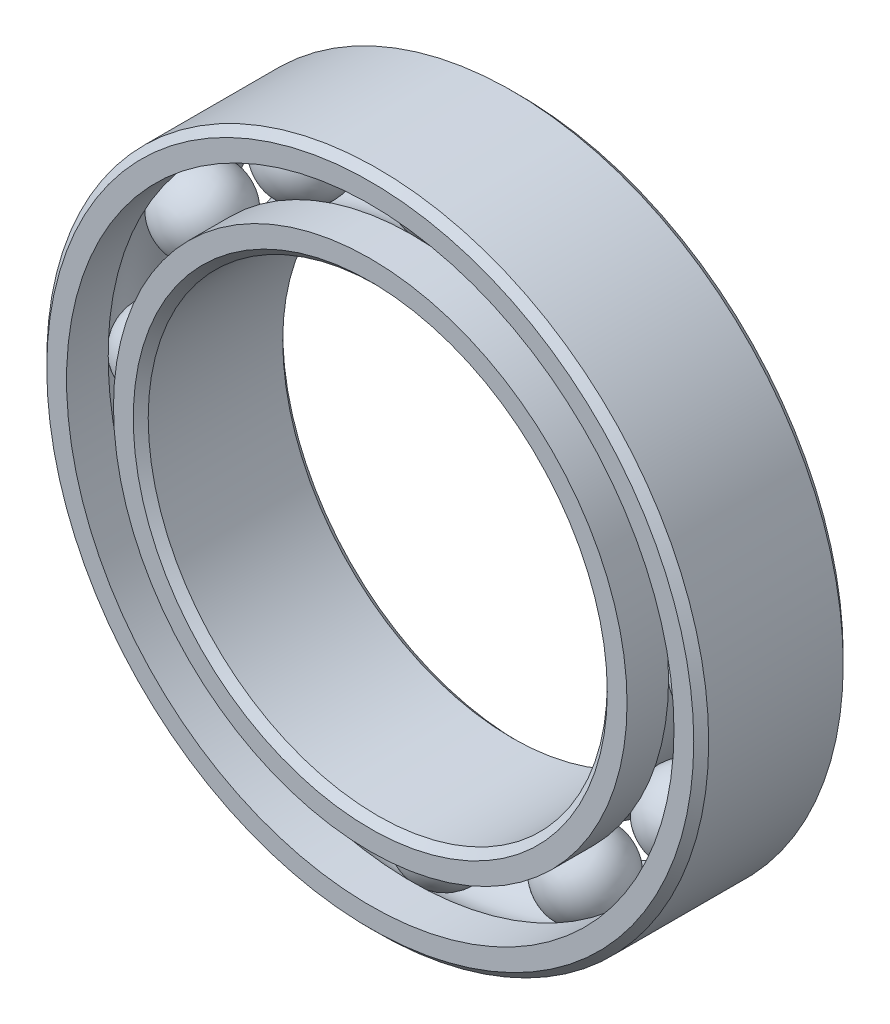
ISO-10303-21;
HEADER;
FILE_DESCRIPTION(('STEP AP214'),'2;1');
FILE_NAME('part.step','',(''),(''),'','','');
FILE_SCHEMA(('AUTOMOTIVE_DESIGN { 1 0 10303 214 1 1 1 1 }'));
ENDSEC;
DATA;
#1=APPLICATION_CONTEXT('core data for automotive mechanical design processes');
#2=APPLICATION_PROTOCOL_DEFINITION('international standard','automotive_design',2000,#1);
#3=PRODUCT_CONTEXT('',#1,'mechanical');
#4=PRODUCT('Part','Part','',(#3));
#5=PRODUCT_RELATED_PRODUCT_CATEGORY('part','',(#4));
#6=PRODUCT_DEFINITION_FORMATION('','',#4);
#7=PRODUCT_DEFINITION_CONTEXT('part definition',#1,'design');
#8=PRODUCT_DEFINITION('design','',#6,#7);
#9=PRODUCT_DEFINITION_SHAPE('','',#8);
#10=(LENGTH_UNIT() NAMED_UNIT(*) SI_UNIT(.MILLI.,.METRE.));
#11=(NAMED_UNIT(*) PLANE_ANGLE_UNIT() SI_UNIT($,.RADIAN.));
#12=(NAMED_UNIT(*) SI_UNIT($,.STERADIAN.) SOLID_ANGLE_UNIT());
#13=UNCERTAINTY_MEASURE_WITH_UNIT(LENGTH_MEASURE(1.E-05),#10,'distance_accuracy_value','');
#14=(GEOMETRIC_REPRESENTATION_CONTEXT(3) GLOBAL_UNCERTAINTY_ASSIGNED_CONTEXT((#13)) GLOBAL_UNIT_ASSIGNED_CONTEXT((#10,
#11,#12)) REPRESENTATION_CONTEXT('',''));
#15=CARTESIAN_POINT('',(0.,0.,0.));
#16=DIRECTION('',(0.,0.,1.));
#17=DIRECTION('',(1.,0.,0.));
#18=AXIS2_PLACEMENT_3D('',#15,#16,#17);
#19=CARTESIAN_POINT('',(-6.56249999999985,11.3665834246708,0.));
#20=DIRECTION('',(0.,0.,1.));
#21=DIRECTION('',(-0.499999999999989,0.866025403784445,0.));
#22=AXIS2_PLACEMENT_3D('',#19,#20,#21);
#23=SPHERICAL_SURFACE('',#22,1.90455682813241);
#24=CARTESIAN_POINT('',(-6.56249999999985,11.3665834246708,1.90455682813241));
#25=VERTEX_POINT('',#24);
#26=VERTEX_LOOP('',#25);
#27=FACE_BOUND('',#26,.T.);
#28=ADVANCED_FACE('F38',(#27),#23,.T.);
#29=CLOSED_SHELL('',(#28));
#30=MANIFOLD_SOLID_BREP('B2',#29);
#31=CARTESIAN_POINT('',(-11.3665834246707,6.56250000000013,0.));
#32=DIRECTION('',(0.,0.,1.));
#33=DIRECTION('',(-0.866025403784433,0.50000000000001,0.));
#34=AXIS2_PLACEMENT_3D('',#31,#32,#33);
#35=SPHERICAL_SURFACE('',#34,1.90455682813241);
#36=CARTESIAN_POINT('',(-11.3665834246707,6.56250000000013,1.90455682813241));
#37=VERTEX_POINT('',#36);
#38=VERTEX_LOOP('',#37);
#39=FACE_BOUND('',#38,.T.);
#40=ADVANCED_FACE('F59',(#39),#35,.T.);
#41=CLOSED_SHELL('',(#40));
#42=MANIFOLD_SOLID_BREP('B6',#41);
#43=CARTESIAN_POINT('',(-13.125,1.37477077716948E-13,0.));
#44=DIRECTION('',(0.,0.,1.));
#45=DIRECTION('',(-1.,0.,0.));
#46=AXIS2_PLACEMENT_3D('',#43,#44,#45);
#47=SPHERICAL_SURFACE('',#46,1.90455682813241);
#48=CARTESIAN_POINT('',(-13.125,1.37477077716948E-13,1.90455682813241));
#49=VERTEX_POINT('',#48);
#50=VERTEX_LOOP('',#49);
#51=FACE_BOUND('',#50,.T.);
#52=ADVANCED_FACE('F80',(#51),#47,.T.);
#53=CLOSED_SHELL('',(#52));
#54=MANIFOLD_SOLID_BREP('B34',#53);
#55=CARTESIAN_POINT('',(-11.3665834246708,-6.56249999999989,0.));
#56=DIRECTION('',(0.,0.,1.));
#57=DIRECTION('',(-0.866025403784443,-0.499999999999992,0.));
#58=AXIS2_PLACEMENT_3D('',#55,#56,#57);
#59=SPHERICAL_SURFACE('',#58,1.90455682813241);
#60=CARTESIAN_POINT('',(-11.3665834246708,-6.56249999999989,1.90455682813241));
#61=VERTEX_POINT('',#60);
#62=VERTEX_LOOP('',#61);
#63=FACE_BOUND('',#62,.T.);
#64=ADVANCED_FACE('F101',(#63),#59,.T.);
#65=CLOSED_SHELL('',(#64));
#66=MANIFOLD_SOLID_BREP('B55',#65);
#67=CARTESIAN_POINT('',(-6.56250000000009,-11.3665834246707,0.));
#68=DIRECTION('',(0.,0.,1.));
#69=DIRECTION('',(-0.500000000000007,-0.866025403784435,0.));
#70=AXIS2_PLACEMENT_3D('',#67,#68,#69);
#71=SPHERICAL_SURFACE('',#70,1.90455682813241);
#72=CARTESIAN_POINT('',(-6.56250000000009,-11.3665834246707,1.90455682813241));
#73=VERTEX_POINT('',#72);
#74=VERTEX_LOOP('',#73);
#75=FACE_BOUND('',#74,.T.);
#76=ADVANCED_FACE('F122',(#75),#71,.T.);
#77=CLOSED_SHELL('',(#76));
#78=MANIFOLD_SOLID_BREP('B76',#77);
#79=CARTESIAN_POINT('',(0.,-13.125,0.));
#80=DIRECTION('',(0.,0.,1.));
#81=DIRECTION('',(0.,-1.,0.));
#82=AXIS2_PLACEMENT_3D('',#79,#80,#81);
#83=SPHERICAL_SURFACE('',#82,1.90455682813241);
#84=CARTESIAN_POINT('',(0.,-13.125,1.90455682813241));
#85=VERTEX_POINT('',#84);
#86=VERTEX_LOOP('',#85);
#87=FACE_BOUND('',#86,.T.);
#88=ADVANCED_FACE('F143',(#87),#83,.T.);
#89=CLOSED_SHELL('',(#88));
#90=MANIFOLD_SOLID_BREP('B97',#89);
#91=CARTESIAN_POINT('',(6.56249999999993,-11.3665834246708,0.));
#92=DIRECTION('',(0.,0.,1.));
#93=DIRECTION('',(0.499999999999995,-0.866025403784442,0.));
#94=AXIS2_PLACEMENT_3D('',#91,#92,#93);
#95=SPHERICAL_SURFACE('',#94,1.90455682813241);
#96=CARTESIAN_POINT('',(6.56249999999993,-11.3665834246708,1.90455682813241));
#97=VERTEX_POINT('',#96);
#98=VERTEX_LOOP('',#97);
#99=FACE_BOUND('',#98,.T.);
#100=ADVANCED_FACE('F164',(#99),#95,.T.);
#101=CLOSED_SHELL('',(#100));
#102=MANIFOLD_SOLID_BREP('B118',#101);
#103=CARTESIAN_POINT('',(11.3665834246707,-6.56250000000005,0.));
#104=DIRECTION('',(0.,0.,1.));
#105=DIRECTION('',(0.866025403784436,-0.500000000000004,0.));
#106=AXIS2_PLACEMENT_3D('',#103,#104,#105);
#107=SPHERICAL_SURFACE('',#106,1.90455682813241);
#108=CARTESIAN_POINT('',(11.3665834246707,-6.56250000000005,1.90455682813241));
#109=VERTEX_POINT('',#108);
#110=VERTEX_LOOP('',#109);
#111=FACE_BOUND('',#110,.T.);
#112=ADVANCED_FACE('F185',(#111),#107,.T.);
#113=CLOSED_SHELL('',(#112));
#114=MANIFOLD_SOLID_BREP('B139',#113);
#115=CARTESIAN_POINT('',(13.125,0.,0.));
#116=DIRECTION('',(0.,0.,1.));
#117=DIRECTION('',(1.,0.,0.));
#118=AXIS2_PLACEMENT_3D('',#115,#116,#117);
#119=SPHERICAL_SURFACE('',#118,1.90455682813241);
#120=CARTESIAN_POINT('',(13.125,0.,1.90455682813241));
#121=VERTEX_POINT('',#120);
#122=VERTEX_LOOP('',#121);
#123=FACE_BOUND('',#122,.T.);
#124=ADVANCED_FACE('F206',(#123),#119,.T.);
#125=CLOSED_SHELL('',(#124));
#126=MANIFOLD_SOLID_BREP('B160',#125);
#127=CARTESIAN_POINT('',(11.3665834246708,6.56249999999997,0.));
#128=DIRECTION('',(0.,0.,1.));
#129=DIRECTION('',(0.86602540378444,0.499999999999998,0.));
#130=AXIS2_PLACEMENT_3D('',#127,#128,#129);
#131=SPHERICAL_SURFACE('',#130,1.90455682813241);
#132=CARTESIAN_POINT('',(11.3665834246708,6.56249999999997,1.90455682813241));
#133=VERTEX_POINT('',#132);
#134=VERTEX_LOOP('',#133);
#135=FACE_BOUND('',#134,.T.);
#136=ADVANCED_FACE('F227',(#135),#131,.T.);
#137=CLOSED_SHELL('',(#136));
#138=MANIFOLD_SOLID_BREP('B181',#137);
#139=CARTESIAN_POINT('',(6.56250000000001,11.3665834246707,0.));
#140=DIRECTION('',(0.,0.,1.));
#141=DIRECTION('',(0.500000000000001,0.866025403784438,0.));
#142=AXIS2_PLACEMENT_3D('',#139,#140,#141);
#143=SPHERICAL_SURFACE('',#142,1.90455682813241);
#144=CARTESIAN_POINT('',(6.56250000000001,11.3665834246707,1.90455682813241));
#145=VERTEX_POINT('',#144);
#146=VERTEX_LOOP('',#145);
#147=FACE_BOUND('',#146,.T.);
#148=ADVANCED_FACE('F248',(#147),#143,.T.);
#149=CLOSED_SHELL('',(#148));
#150=MANIFOLD_SOLID_BREP('B202',#149);
#151=CARTESIAN_POINT('',(0.,13.125,0.));
#152=DIRECTION('',(0.,0.,1.));
#153=DIRECTION('',(0.,1.,0.));
#154=AXIS2_PLACEMENT_3D('',#151,#152,#153);
#155=SPHERICAL_SURFACE('',#154,1.90455682813241);
#156=CARTESIAN_POINT('',(0.,13.125,1.90455682813241));
#157=VERTEX_POINT('',#156);
#158=VERTEX_LOOP('',#157);
#159=FACE_BOUND('',#158,.T.);
#160=ADVANCED_FACE('F271',(#159),#155,.T.);
#161=CLOSED_SHELL('',(#160));
#162=MANIFOLD_SOLID_BREP('B223',#161);
#163=CARTESIAN_POINT('',(0.,12.0260989010989,3.5));
#164=DIRECTION('',(0.,0.,-1.));
#165=DIRECTION('',(-1.,0.,0.));
#166=AXIS2_PLACEMENT_3D('',#163,#164,#165);
#167=PLANE('',#166);
#168=CARTESIAN_POINT('',(0.,0.,3.5));
#169=DIRECTION('',(0.,0.,1.));
#170=DIRECTION('',(1.,0.,0.));
#171=AXIS2_PLACEMENT_3D('',#168,#169,#170);
#172=CIRCLE('',#171,11.1);
#173=CARTESIAN_POINT('',(11.1,0.,3.5));
#174=VERTEX_POINT('',#173);
#175=EDGE_CURVE('E319',#174,#174,#172,.T.);
#176=ORIENTED_EDGE('',*,*,#175,.F.);
#177=EDGE_LOOP('',(#176));
#178=FACE_BOUND('',#177,.T.);
#179=CARTESIAN_POINT('',(0.,0.,3.5));
#180=DIRECTION('',(0.,0.,1.));
#181=DIRECTION('',(1.,0.,0.));
#182=AXIS2_PLACEMENT_3D('',#179,#180,#181);
#183=CIRCLE('',#182,12.0260989010989);
#184=CARTESIAN_POINT('',(12.0260989010989,0.,3.5));
#185=VERTEX_POINT('',#184);
#186=EDGE_CURVE('E270',#185,#185,#183,.T.);
#187=ORIENTED_EDGE('',*,*,#186,.T.);
#188=EDGE_LOOP('',(#187));
#189=FACE_BOUND('',#188,.T.);
#190=ADVANCED_FACE('F291',(#178,#189),#167,.F.);
#191=CARTESIAN_POINT('',(0.,0.,3.5));
#192=DIRECTION('',(0.,0.,1.));
#193=DIRECTION('',(1.,0.,0.));
#194=AXIS2_PLACEMENT_3D('',#191,#192,#193);
#195=CYLINDRICAL_SURFACE('',#194,12.0260989010989);
#196=ORIENTED_EDGE('',*,*,#186,.F.);
#197=EDGE_LOOP('',(#196));
#198=FACE_BOUND('',#197,.T.);
#199=CARTESIAN_POINT('',(0.,0.,1.55555555555556));
#200=DIRECTION('',(0.,0.,1.));
#201=DIRECTION('',(1.,0.,0.));
#202=AXIS2_PLACEMENT_3D('',#199,#200,#201);
#203=CIRCLE('',#202,12.0260989010989);
#204=CARTESIAN_POINT('',(12.0260989010989,0.,1.55555555555556));
#205=VERTEX_POINT('',#204);
#206=EDGE_CURVE('E297',#205,#205,#203,.T.);
#207=ORIENTED_EDGE('',*,*,#206,.T.);
#208=EDGE_LOOP('',(#207));
#209=FACE_BOUND('',#208,.T.);
#210=ADVANCED_FACE('F326',(#198,#209),#195,.T.);
#211=CARTESIAN_POINT('',(0.,0.,0.));
#212=DIRECTION('',(0.,0.,1.));
#213=DIRECTION('',(1.,0.,0.));
#214=AXIS2_PLACEMENT_3D('',#211,#212,#213);
#215=TOROIDAL_SURFACE('',#214,13.125,1.90455682813241);
#216=ORIENTED_EDGE('',*,*,#206,.F.);
#217=EDGE_LOOP('',(#216));
#218=FACE_BOUND('',#217,.T.);
#219=CARTESIAN_POINT('',(0.,0.,-1.55555555555556));
#220=DIRECTION('',(0.,0.,1.));
#221=DIRECTION('',(1.,0.,0.));
#222=AXIS2_PLACEMENT_3D('',#219,#220,#221);
#223=CIRCLE('',#222,12.0260989010989);
#224=CARTESIAN_POINT('',(12.0260989010989,0.,-1.55555555555556));
#225=VERTEX_POINT('',#224);
#226=EDGE_CURVE('E301',#225,#225,#223,.T.);
#227=ORIENTED_EDGE('',*,*,#226,.T.);
#228=EDGE_LOOP('',(#227));
#229=FACE_BOUND('',#228,.T.);
#230=ADVANCED_FACE('F330',(#218,#229),#215,.F.);
#231=CARTESIAN_POINT('',(0.,0.,3.5));
#232=DIRECTION('',(0.,0.,1.));
#233=DIRECTION('',(1.,0.,0.));
#234=AXIS2_PLACEMENT_3D('',#231,#232,#233);
#235=CYLINDRICAL_SURFACE('',#234,12.0260989010989);
#236=ORIENTED_EDGE('',*,*,#226,.F.);
#237=EDGE_LOOP('',(#236));
#238=FACE_BOUND('',#237,.T.);
#239=CARTESIAN_POINT('',(0.,0.,-3.5));
#240=DIRECTION('',(0.,0.,1.));
#241=DIRECTION('',(1.,0.,0.));
#242=AXIS2_PLACEMENT_3D('',#239,#240,#241);
#243=CIRCLE('',#242,12.0260989010989);
#244=CARTESIAN_POINT('',(12.0260989010989,0.,-3.5));
#245=VERTEX_POINT('',#244);
#246=EDGE_CURVE('E305',#245,#245,#243,.T.);
#247=ORIENTED_EDGE('',*,*,#246,.T.);
#248=EDGE_LOOP('',(#247));
#249=FACE_BOUND('',#248,.T.);
#250=ADVANCED_FACE('F335',(#238,#249),#235,.T.);
#251=CARTESIAN_POINT('',(0.,11.1,-3.5));
#252=DIRECTION('',(0.,0.,1.));
#253=DIRECTION('',(1.,0.,0.));
#254=AXIS2_PLACEMENT_3D('',#251,#252,#253);
#255=PLANE('',#254);
#256=ORIENTED_EDGE('',*,*,#246,.F.);
#257=EDGE_LOOP('',(#256));
#258=FACE_BOUND('',#257,.T.);
#259=CARTESIAN_POINT('',(0.,0.,-3.5));
#260=DIRECTION('',(0.,0.,1.));
#261=DIRECTION('',(1.,0.,0.));
#262=AXIS2_PLACEMENT_3D('',#259,#260,#261);
#263=CIRCLE('',#262,11.1);
#264=CARTESIAN_POINT('',(11.1,0.,-3.5));
#265=VERTEX_POINT('',#264);
#266=EDGE_CURVE('E310',#265,#265,#263,.T.);
#267=ORIENTED_EDGE('',*,*,#266,.T.);
#268=EDGE_LOOP('',(#267));
#269=FACE_BOUND('',#268,.T.);
#270=ADVANCED_FACE('F341',(#258,#269),#255,.F.);
#271=CARTESIAN_POINT('',(0.,0.,-3.15));
#272=DIRECTION('',(0.,0.,-1.));
#273=DIRECTION('',(-1.,0.,0.));
#274=AXIS2_PLACEMENT_3D('',#271,#272,#273);
#275=CONICAL_SURFACE('',#274,10.75,0.785398163397445);
#276=ORIENTED_EDGE('',*,*,#266,.F.);
#277=EDGE_LOOP('',(#276));
#278=FACE_BOUND('',#277,.T.);
#279=CARTESIAN_POINT('',(0.,0.,-3.15));
#280=DIRECTION('',(0.,0.,1.));
#281=DIRECTION('',(1.,0.,0.));
#282=AXIS2_PLACEMENT_3D('',#279,#280,#281);
#283=CIRCLE('',#282,10.75);
#284=CARTESIAN_POINT('',(10.75,0.,-3.15));
#285=VERTEX_POINT('',#284);
#286=EDGE_CURVE('E313',#285,#285,#283,.T.);
#287=ORIENTED_EDGE('',*,*,#286,.T.);
#288=EDGE_LOOP('',(#287));
#289=FACE_BOUND('',#288,.T.);
#290=ADVANCED_FACE('F345',(#278,#289),#275,.F.);
#291=CARTESIAN_POINT('',(0.,0.,3.5));
#292=DIRECTION('',(0.,0.,1.));
#293=DIRECTION('',(1.,0.,0.));
#294=AXIS2_PLACEMENT_3D('',#291,#292,#293);
#295=CYLINDRICAL_SURFACE('',#294,10.75);
#296=ORIENTED_EDGE('',*,*,#286,.F.);
#297=EDGE_LOOP('',(#296));
#298=FACE_BOUND('',#297,.T.);
#299=CARTESIAN_POINT('',(0.,0.,3.15000000000001));
#300=DIRECTION('',(0.,0.,1.));
#301=DIRECTION('',(1.,0.,0.));
#302=AXIS2_PLACEMENT_3D('',#299,#300,#301);
#303=CIRCLE('',#302,10.75);
#304=CARTESIAN_POINT('',(10.75,0.,3.15000000000001));
#305=VERTEX_POINT('',#304);
#306=EDGE_CURVE('E316',#305,#305,#303,.T.);
#307=ORIENTED_EDGE('',*,*,#306,.T.);
#308=EDGE_LOOP('',(#307));
#309=FACE_BOUND('',#308,.T.);
#310=ADVANCED_FACE('F349',(#298,#309),#295,.F.);
#311=CARTESIAN_POINT('',(0.,0.,3.5));
#312=DIRECTION('',(0.,0.,1.));
#313=DIRECTION('',(1.,0.,0.));
#314=AXIS2_PLACEMENT_3D('',#311,#312,#313);
#315=CONICAL_SURFACE('',#314,11.1,0.785398163397453);
#316=ORIENTED_EDGE('',*,*,#306,.F.);
#317=EDGE_LOOP('',(#316));
#318=FACE_BOUND('',#317,.T.);
#319=ORIENTED_EDGE('',*,*,#175,.T.);
#320=EDGE_LOOP('',(#319));
#321=FACE_BOUND('',#320,.T.);
#322=ADVANCED_FACE('F323',(#318,#321),#315,.F.);
#323=CLOSED_SHELL('',(#190,#210,#230,#250,#270,#290,#310,#322));
#324=MANIFOLD_SOLID_BREP('B244',#323);
#325=CARTESIAN_POINT('',(0.,0.,3.15));
#326=DIRECTION('',(0.,0.,-1.));
#327=DIRECTION('',(-1.,0.,0.));
#328=AXIS2_PLACEMENT_3D('',#325,#326,#327);
#329=CONICAL_SURFACE('',#328,15.5,0.785398163397448);
#330=CARTESIAN_POINT('',(0.,0.,3.5));
#331=DIRECTION('',(0.,0.,1.));
#332=DIRECTION('',(1.,0.,0.));
#333=AXIS2_PLACEMENT_3D('',#330,#331,#332);
#334=CIRCLE('',#333,15.15);
#335=CARTESIAN_POINT('',(15.15,0.,3.5));
#336=VERTEX_POINT('',#335);
#337=EDGE_CURVE('E441',#336,#336,#334,.T.);
#338=ORIENTED_EDGE('',*,*,#337,.F.);
#339=EDGE_LOOP('',(#338));
#340=FACE_BOUND('',#339,.T.);
#341=CARTESIAN_POINT('',(0.,0.,3.15));
#342=DIRECTION('',(0.,0.,1.));
#343=DIRECTION('',(1.,0.,0.));
#344=AXIS2_PLACEMENT_3D('',#341,#342,#343);
#345=CIRCLE('',#344,15.5);
#346=CARTESIAN_POINT('',(15.5,0.,3.15));
#347=VERTEX_POINT('',#346);
#348=EDGE_CURVE('E290',#347,#347,#345,.T.);
#349=ORIENTED_EDGE('',*,*,#348,.T.);
#350=EDGE_LOOP('',(#349));
#351=FACE_BOUND('',#350,.T.);
#352=ADVANCED_FACE('F413',(#340,#351),#329,.T.);
#353=CARTESIAN_POINT('',(0.,0.,3.5));
#354=DIRECTION('',(0.,0.,1.));
#355=DIRECTION('',(1.,0.,0.));
#356=AXIS2_PLACEMENT_3D('',#353,#354,#355);
#357=CYLINDRICAL_SURFACE('',#356,15.5);
#358=ORIENTED_EDGE('',*,*,#348,.F.);
#359=EDGE_LOOP('',(#358));
#360=FACE_BOUND('',#359,.T.);
#361=CARTESIAN_POINT('',(0.,0.,-3.15));
#362=DIRECTION('',(0.,0.,1.));
#363=DIRECTION('',(1.,0.,0.));
#364=AXIS2_PLACEMENT_3D('',#361,#362,#363);
#365=CIRCLE('',#364,15.5);
#366=CARTESIAN_POINT('',(15.5,0.,-3.15));
#367=VERTEX_POINT('',#366);
#368=EDGE_CURVE('E419',#367,#367,#365,.T.);
#369=ORIENTED_EDGE('',*,*,#368,.T.);
#370=EDGE_LOOP('',(#369));
#371=FACE_BOUND('',#370,.T.);
#372=ADVANCED_FACE('F448',(#360,#371),#357,.T.);
#373=CARTESIAN_POINT('',(0.,0.,-3.5));
#374=DIRECTION('',(0.,0.,1.));
#375=DIRECTION('',(1.,0.,0.));
#376=AXIS2_PLACEMENT_3D('',#373,#374,#375);
#377=CONICAL_SURFACE('',#376,15.15,0.785398163397443);
#378=ORIENTED_EDGE('',*,*,#368,.F.);
#379=EDGE_LOOP('',(#378));
#380=FACE_BOUND('',#379,.T.);
#381=CARTESIAN_POINT('',(0.,0.,-3.5));
#382=DIRECTION('',(0.,0.,1.));
#383=DIRECTION('',(1.,0.,0.));
#384=AXIS2_PLACEMENT_3D('',#381,#382,#383);
#385=CIRCLE('',#384,15.15);
#386=CARTESIAN_POINT('',(15.15,0.,-3.5));
#387=VERTEX_POINT('',#386);
#388=EDGE_CURVE('E423',#387,#387,#385,.T.);
#389=ORIENTED_EDGE('',*,*,#388,.T.);
#390=EDGE_LOOP('',(#389));
#391=FACE_BOUND('',#390,.T.);
#392=ADVANCED_FACE('F452',(#380,#391),#377,.T.);
#393=CARTESIAN_POINT('',(0.,15.15,-3.5));
#394=DIRECTION('',(0.,0.,1.));
#395=DIRECTION('',(1.,0.,0.));
#396=AXIS2_PLACEMENT_3D('',#393,#394,#395);
#397=PLANE('',#396);
#398=ORIENTED_EDGE('',*,*,#388,.F.);
#399=EDGE_LOOP('',(#398));
#400=FACE_BOUND('',#399,.T.);
#401=CARTESIAN_POINT('',(0.,0.,-3.5));
#402=DIRECTION('',(0.,0.,1.));
#403=DIRECTION('',(1.,0.,0.));
#404=AXIS2_PLACEMENT_3D('',#401,#402,#403);
#405=CIRCLE('',#404,14.2239010989011);
#406=CARTESIAN_POINT('',(14.2239010989011,0.,-3.5));
#407=VERTEX_POINT('',#406);
#408=EDGE_CURVE('E427',#407,#407,#405,.T.);
#409=ORIENTED_EDGE('',*,*,#408,.T.);
#410=EDGE_LOOP('',(#409));
#411=FACE_BOUND('',#410,.T.);
#412=ADVANCED_FACE('F457',(#400,#411),#397,.F.);
#413=CARTESIAN_POINT('',(0.,0.,3.5));
#414=DIRECTION('',(0.,0.,1.));
#415=DIRECTION('',(1.,0.,0.));
#416=AXIS2_PLACEMENT_3D('',#413,#414,#415);
#417=CYLINDRICAL_SURFACE('',#416,14.2239010989011);
#418=ORIENTED_EDGE('',*,*,#408,.F.);
#419=EDGE_LOOP('',(#418));
#420=FACE_BOUND('',#419,.T.);
#421=CARTESIAN_POINT('',(0.,0.,-1.55555555555556));
#422=DIRECTION('',(0.,0.,1.));
#423=DIRECTION('',(1.,0.,0.));
#424=AXIS2_PLACEMENT_3D('',#421,#422,#423);
#425=CIRCLE('',#424,14.2239010989011);
#426=CARTESIAN_POINT('',(14.2239010989011,0.,-1.55555555555556));
#427=VERTEX_POINT('',#426);
#428=EDGE_CURVE('E432',#427,#427,#425,.T.);
#429=ORIENTED_EDGE('',*,*,#428,.T.);
#430=EDGE_LOOP('',(#429));
#431=FACE_BOUND('',#430,.T.);
#432=ADVANCED_FACE('F463',(#420,#431),#417,.F.);
#433=CARTESIAN_POINT('',(0.,0.,0.));
#434=DIRECTION('',(0.,0.,1.));
#435=DIRECTION('',(1.,0.,0.));
#436=AXIS2_PLACEMENT_3D('',#433,#434,#435);
#437=TOROIDAL_SURFACE('',#436,13.125,1.90455682813241);
#438=ORIENTED_EDGE('',*,*,#428,.F.);
#439=EDGE_LOOP('',(#438));
#440=FACE_BOUND('',#439,.T.);
#441=CARTESIAN_POINT('',(0.,0.,1.55555555555556));
#442=DIRECTION('',(0.,0.,1.));
#443=DIRECTION('',(1.,0.,0.));
#444=AXIS2_PLACEMENT_3D('',#441,#442,#443);
#445=CIRCLE('',#444,14.2239010989011);
#446=CARTESIAN_POINT('',(14.2239010989011,0.,1.55555555555556));
#447=VERTEX_POINT('',#446);
#448=EDGE_CURVE('E435',#447,#447,#445,.T.);
#449=ORIENTED_EDGE('',*,*,#448,.T.);
#450=EDGE_LOOP('',(#449));
#451=FACE_BOUND('',#450,.T.);
#452=ADVANCED_FACE('F467',(#440,#451),#437,.F.);
#453=CARTESIAN_POINT('',(0.,0.,3.5));
#454=DIRECTION('',(0.,0.,1.));
#455=DIRECTION('',(1.,0.,0.));
#456=AXIS2_PLACEMENT_3D('',#453,#454,#455);
#457=CYLINDRICAL_SURFACE('',#456,14.2239010989011);
#458=ORIENTED_EDGE('',*,*,#448,.F.);
#459=EDGE_LOOP('',(#458));
#460=FACE_BOUND('',#459,.T.);
#461=CARTESIAN_POINT('',(0.,0.,3.5));
#462=DIRECTION('',(0.,0.,1.));
#463=DIRECTION('',(1.,0.,0.));
#464=AXIS2_PLACEMENT_3D('',#461,#462,#463);
#465=CIRCLE('',#464,14.2239010989011);
#466=CARTESIAN_POINT('',(14.2239010989011,0.,3.5));
#467=VERTEX_POINT('',#466);
#468=EDGE_CURVE('E438',#467,#467,#465,.T.);
#469=ORIENTED_EDGE('',*,*,#468,.T.);
#470=EDGE_LOOP('',(#469));
#471=FACE_BOUND('',#470,.T.);
#472=ADVANCED_FACE('F471',(#460,#471),#457,.F.);
#473=CARTESIAN_POINT('',(0.,15.15,3.5));
#474=DIRECTION('',(0.,0.,-1.));
#475=DIRECTION('',(-1.,0.,0.));
#476=AXIS2_PLACEMENT_3D('',#473,#474,#475);
#477=PLANE('',#476);
#478=ORIENTED_EDGE('',*,*,#468,.F.);
#479=EDGE_LOOP('',(#478));
#480=FACE_BOUND('',#479,.T.);
#481=ORIENTED_EDGE('',*,*,#337,.T.);
#482=EDGE_LOOP('',(#481));
#483=FACE_BOUND('',#482,.T.);
#484=ADVANCED_FACE('F445',(#480,#483),#477,.F.);
#485=CLOSED_SHELL('',(#352,#372,#392,#412,#432,#452,#472,#484));
#486=MANIFOLD_SOLID_BREP('B265',#485);
#487=ADVANCED_BREP_SHAPE_REPRESENTATION('',(#18,#30,#42,#54,#66,#78,#90,#102,#114,#126,#138,
#150,#162,#324,#486),#14);
#488=SHAPE_DEFINITION_REPRESENTATION(#9,#487);
ENDSEC;
END-ISO-10303-21;
